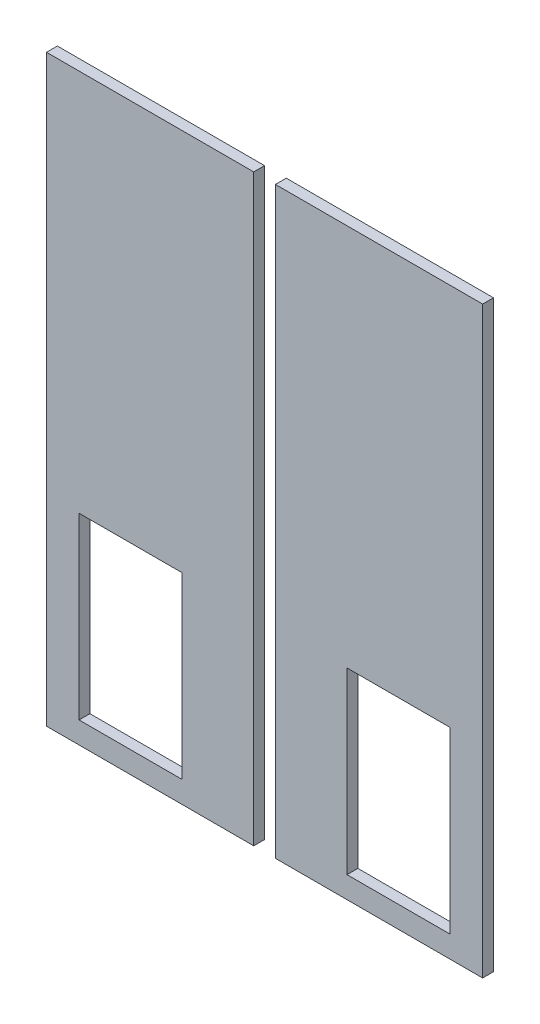
ISO-10303-21;
HEADER;
FILE_DESCRIPTION(('STEP AP214'),'2;1');
FILE_NAME('part.step','',(''),(''),'','','');
FILE_SCHEMA(('AUTOMOTIVE_DESIGN { 1 0 10303 214 1 1 1 1 }'));
ENDSEC;
DATA;
#1=APPLICATION_CONTEXT('core data for automotive mechanical design processes');
#2=APPLICATION_PROTOCOL_DEFINITION('international standard','automotive_design',2000,#1);
#3=PRODUCT_CONTEXT('',#1,'mechanical');
#4=PRODUCT('Part','Part','',(#3));
#5=PRODUCT_RELATED_PRODUCT_CATEGORY('part','',(#4));
#6=PRODUCT_DEFINITION_FORMATION('','',#4);
#7=PRODUCT_DEFINITION_CONTEXT('part definition',#1,'design');
#8=PRODUCT_DEFINITION('design','',#6,#7);
#9=PRODUCT_DEFINITION_SHAPE('','',#8);
#10=(LENGTH_UNIT() NAMED_UNIT(*) SI_UNIT(.MILLI.,.METRE.));
#11=(NAMED_UNIT(*) PLANE_ANGLE_UNIT() SI_UNIT($,.RADIAN.));
#12=(NAMED_UNIT(*) SI_UNIT($,.STERADIAN.) SOLID_ANGLE_UNIT());
#13=UNCERTAINTY_MEASURE_WITH_UNIT(LENGTH_MEASURE(1.E-05),#10,'distance_accuracy_value','');
#14=(GEOMETRIC_REPRESENTATION_CONTEXT(3) GLOBAL_UNCERTAINTY_ASSIGNED_CONTEXT((#13)) GLOBAL_UNIT_ASSIGNED_CONTEXT((#10,
#11,#12)) REPRESENTATION_CONTEXT('',''));
#15=CARTESIAN_POINT('',(0.,0.,0.));
#16=DIRECTION('',(0.,0.,1.));
#17=DIRECTION('',(1.,0.,0.));
#18=AXIS2_PLACEMENT_3D('',#15,#16,#17);
#19=CARTESIAN_POINT('',(0.,341.63,12.7));
#20=DIRECTION('',(0.,1.,0.));
#21=DIRECTION('',(0.,0.,1.));
#22=AXIS2_PLACEMENT_3D('',#19,#20,#21);
#23=PLANE('',#22);
#24=DIRECTION('',(1.,0.,0.));
#25=VECTOR('',#24,1.);
#26=CARTESIAN_POINT('',(0.,341.63,0.));
#27=LINE('',#26,#25);
#28=CARTESIAN_POINT('',(12.7,341.63,0.));
#29=VERTEX_POINT('',#28);
#30=CARTESIAN_POINT('',(255.27,341.63,0.));
#31=VERTEX_POINT('',#30);
#32=EDGE_CURVE('E172',#29,#31,#27,.T.);
#33=ORIENTED_EDGE('',*,*,#32,.F.);
#34=DIRECTION('',(0.,0.,-1.));
#35=VECTOR('',#34,1.);
#36=CARTESIAN_POINT('',(12.7,341.63,12.7));
#37=LINE('',#36,#35);
#38=CARTESIAN_POINT('',(12.7,341.63,12.7));
#39=VERTEX_POINT('',#38);
#40=EDGE_CURVE('E12',#39,#29,#37,.T.);
#41=ORIENTED_EDGE('',*,*,#40,.F.);
#42=DIRECTION('',(1.,0.,0.));
#43=VECTOR('',#42,1.);
#44=CARTESIAN_POINT('',(0.,341.63,12.7));
#45=LINE('',#44,#43);
#46=CARTESIAN_POINT('',(255.27,341.63,12.7));
#47=VERTEX_POINT('',#46);
#48=EDGE_CURVE('E142',#39,#47,#45,.T.);
#49=ORIENTED_EDGE('',*,*,#48,.T.);
#50=DIRECTION('',(0.,0.,-1.));
#51=VECTOR('',#50,1.);
#52=CARTESIAN_POINT('',(255.27,341.63,12.7));
#53=LINE('',#52,#51);
#54=EDGE_CURVE('E76',#47,#31,#53,.T.);
#55=ORIENTED_EDGE('',*,*,#54,.T.);
#56=EDGE_LOOP('',(#33,#41,#49,#55));
#57=FACE_BOUND('',#56,.T.);
#58=ADVANCED_FACE('F57',(#57),#23,.T.);
#59=CARTESIAN_POINT('',(12.7,0.,12.7));
#60=DIRECTION('',(1.,0.,0.));
#61=DIRECTION('',(0.,1.,0.));
#62=AXIS2_PLACEMENT_3D('',#59,#60,#61);
#63=PLANE('',#62);
#64=DIRECTION('',(0.,-1.,0.));
#65=VECTOR('',#64,1.);
#66=CARTESIAN_POINT('',(12.7,0.,0.));
#67=LINE('',#66,#65);
#68=CARTESIAN_POINT('',(12.7,-341.63,0.));
#69=VERTEX_POINT('',#68);
#70=EDGE_CURVE('E147',#29,#69,#67,.T.);
#71=ORIENTED_EDGE('',*,*,#70,.T.);
#72=DIRECTION('',(0.,0.,-1.));
#73=VECTOR('',#72,1.);
#74=CARTESIAN_POINT('',(12.7,-341.63,12.7));
#75=LINE('',#74,#73);
#76=CARTESIAN_POINT('',(12.7,-341.63,12.7));
#77=VERTEX_POINT('',#76);
#78=EDGE_CURVE('E67',#77,#69,#75,.T.);
#79=ORIENTED_EDGE('',*,*,#78,.F.);
#80=DIRECTION('',(0.,-1.,0.));
#81=VECTOR('',#80,1.);
#82=CARTESIAN_POINT('',(12.7,0.,12.7));
#83=LINE('',#82,#81);
#84=EDGE_CURVE('E137',#39,#77,#83,.T.);
#85=ORIENTED_EDGE('',*,*,#84,.F.);
#86=ORIENTED_EDGE('',*,*,#40,.T.);
#87=EDGE_LOOP('',(#71,#79,#85,#86));
#88=FACE_BOUND('',#87,.T.);
#89=ADVANCED_FACE('F145',(#88),#63,.F.);
#90=CARTESIAN_POINT('',(0.,-341.63,12.7));
#91=DIRECTION('',(0.,1.,0.));
#92=DIRECTION('',(0.,0.,1.));
#93=AXIS2_PLACEMENT_3D('',#90,#91,#92);
#94=PLANE('',#93);
#95=DIRECTION('',(1.,0.,0.));
#96=VECTOR('',#95,1.);
#97=CARTESIAN_POINT('',(0.,-341.63,0.));
#98=LINE('',#97,#96);
#99=CARTESIAN_POINT('',(255.27,-341.63,0.));
#100=VERTEX_POINT('',#99);
#101=EDGE_CURVE('E169',#69,#100,#98,.T.);
#102=ORIENTED_EDGE('',*,*,#101,.T.);
#103=DIRECTION('',(0.,0.,-1.));
#104=VECTOR('',#103,1.);
#105=CARTESIAN_POINT('',(255.27,-341.63,12.7));
#106=LINE('',#105,#104);
#107=CARTESIAN_POINT('',(255.27,-341.63,12.7));
#108=VERTEX_POINT('',#107);
#109=EDGE_CURVE('E102',#108,#100,#106,.T.);
#110=ORIENTED_EDGE('',*,*,#109,.F.);
#111=DIRECTION('',(1.,0.,0.));
#112=VECTOR('',#111,1.);
#113=CARTESIAN_POINT('',(0.,-341.63,12.7));
#114=LINE('',#113,#112);
#115=EDGE_CURVE('E129',#77,#108,#114,.T.);
#116=ORIENTED_EDGE('',*,*,#115,.F.);
#117=ORIENTED_EDGE('',*,*,#78,.T.);
#118=EDGE_LOOP('',(#102,#110,#116,#117));
#119=FACE_BOUND('',#118,.T.);
#120=ADVANCED_FACE('F131',(#119),#94,.F.);
#121=CARTESIAN_POINT('',(0.,-106.68,12.7));
#122=DIRECTION('',(0.,-1.,0.));
#123=DIRECTION('',(1.,0.,0.));
#124=AXIS2_PLACEMENT_3D('',#121,#122,#123);
#125=PLANE('',#124);
#126=DIRECTION('',(-1.,0.,0.));
#127=VECTOR('',#126,1.);
#128=CARTESIAN_POINT('',(0.,-106.68,0.));
#129=LINE('',#128,#127);
#130=CARTESIAN_POINT('',(217.17,-106.68,0.));
#131=VERTEX_POINT('',#130);
#132=CARTESIAN_POINT('',(96.52,-106.68,0.));
#133=VERTEX_POINT('',#132);
#134=EDGE_CURVE('E181',#131,#133,#129,.T.);
#135=ORIENTED_EDGE('',*,*,#134,.F.);
#136=DIRECTION('',(0.,0.,-1.));
#137=VECTOR('',#136,1.);
#138=CARTESIAN_POINT('',(217.17,-106.68,12.7));
#139=LINE('',#138,#137);
#140=CARTESIAN_POINT('',(217.17,-106.68,12.7));
#141=VERTEX_POINT('',#140);
#142=EDGE_CURVE('E61',#141,#131,#139,.T.);
#143=ORIENTED_EDGE('',*,*,#142,.F.);
#144=DIRECTION('',(-1.,0.,0.));
#145=VECTOR('',#144,1.);
#146=CARTESIAN_POINT('',(0.,-106.68,12.7));
#147=LINE('',#146,#145);
#148=CARTESIAN_POINT('',(96.52,-106.68,12.7));
#149=VERTEX_POINT('',#148);
#150=EDGE_CURVE('E168',#141,#149,#147,.T.);
#151=ORIENTED_EDGE('',*,*,#150,.T.);
#152=DIRECTION('',(0.,0.,-1.));
#153=VECTOR('',#152,1.);
#154=CARTESIAN_POINT('',(96.52,-106.68,12.7));
#155=LINE('',#154,#153);
#156=EDGE_CURVE('E152',#149,#133,#155,.T.);
#157=ORIENTED_EDGE('',*,*,#156,.T.);
#158=EDGE_LOOP('',(#135,#143,#151,#157));
#159=FACE_BOUND('',#158,.T.);
#160=ADVANCED_FACE('F59',(#159),#125,.T.);
#161=CARTESIAN_POINT('',(217.17,1.72589215646274E-13,12.7));
#162=DIRECTION('',(1.,0.,0.));
#163=DIRECTION('',(0.,1.,0.));
#164=AXIS2_PLACEMENT_3D('',#161,#162,#163);
#165=PLANE('',#164);
#166=DIRECTION('',(0.,-1.,0.));
#167=VECTOR('',#166,1.);
#168=CARTESIAN_POINT('',(217.17,1.72589215646274E-13,0.));
#169=LINE('',#168,#167);
#170=CARTESIAN_POINT('',(217.17,-316.23,0.));
#171=VERTEX_POINT('',#170);
#172=EDGE_CURVE('E179',#131,#171,#169,.T.);
#173=ORIENTED_EDGE('',*,*,#172,.T.);
#174=DIRECTION('',(0.,0.,-1.));
#175=VECTOR('',#174,1.);
#176=CARTESIAN_POINT('',(217.17,-316.23,12.7));
#177=LINE('',#176,#175);
#178=CARTESIAN_POINT('',(217.17,-316.23,12.7));
#179=VERTEX_POINT('',#178);
#180=EDGE_CURVE('E156',#179,#171,#177,.T.);
#181=ORIENTED_EDGE('',*,*,#180,.F.);
#182=DIRECTION('',(0.,-1.,0.));
#183=VECTOR('',#182,1.);
#184=CARTESIAN_POINT('',(217.17,1.72589215646274E-13,12.7));
#185=LINE('',#184,#183);
#186=EDGE_CURVE('E190',#141,#179,#185,.T.);
#187=ORIENTED_EDGE('',*,*,#186,.F.);
#188=ORIENTED_EDGE('',*,*,#142,.T.);
#189=EDGE_LOOP('',(#173,#181,#187,#188));
#190=FACE_BOUND('',#189,.T.);
#191=ADVANCED_FACE('F203',(#190),#165,.F.);
#192=CARTESIAN_POINT('',(-1.45497649016665E-13,-316.23,12.7));
#193=DIRECTION('',(0.,-1.,0.));
#194=DIRECTION('',(1.,0.,0.));
#195=AXIS2_PLACEMENT_3D('',#192,#193,#194);
#196=PLANE('',#195);
#197=DIRECTION('',(-1.,0.,0.));
#198=VECTOR('',#197,1.);
#199=CARTESIAN_POINT('',(-1.45497649016665E-13,-316.23,0.));
#200=LINE('',#199,#198);
#201=CARTESIAN_POINT('',(96.5200000000001,-316.23,0.));
#202=VERTEX_POINT('',#201);
#203=EDGE_CURVE('E177',#171,#202,#200,.T.);
#204=ORIENTED_EDGE('',*,*,#203,.T.);
#205=DIRECTION('',(0.,0.,-1.));
#206=VECTOR('',#205,1.);
#207=CARTESIAN_POINT('',(96.5200000000001,-316.23,12.7));
#208=LINE('',#207,#206);
#209=CARTESIAN_POINT('',(96.5200000000001,-316.23,12.7));
#210=VERTEX_POINT('',#209);
#211=EDGE_CURVE('E154',#210,#202,#208,.T.);
#212=ORIENTED_EDGE('',*,*,#211,.F.);
#213=DIRECTION('',(-1.,0.,0.));
#214=VECTOR('',#213,1.);
#215=CARTESIAN_POINT('',(-1.45497649016665E-13,-316.23,12.7));
#216=LINE('',#215,#214);
#217=EDGE_CURVE('E188',#179,#210,#216,.T.);
#218=ORIENTED_EDGE('',*,*,#217,.F.);
#219=ORIENTED_EDGE('',*,*,#180,.T.);
#220=EDGE_LOOP('',(#204,#212,#218,#219));
#221=FACE_BOUND('',#220,.T.);
#222=ADVANCED_FACE('F204',(#221),#196,.F.);
#223=CARTESIAN_POINT('',(96.52,0.,12.7));
#224=DIRECTION('',(-1.,0.,0.));
#225=DIRECTION('',(0.,-1.,0.));
#226=AXIS2_PLACEMENT_3D('',#223,#224,#225);
#227=PLANE('',#226);
#228=DIRECTION('',(0.,1.,0.));
#229=VECTOR('',#228,1.);
#230=CARTESIAN_POINT('',(96.52,0.,0.));
#231=LINE('',#230,#229);
#232=EDGE_CURVE('E174',#202,#133,#231,.T.);
#233=ORIENTED_EDGE('',*,*,#232,.T.);
#234=ORIENTED_EDGE('',*,*,#156,.F.);
#235=DIRECTION('',(0.,1.,0.));
#236=VECTOR('',#235,1.);
#237=CARTESIAN_POINT('',(96.52,0.,12.7));
#238=LINE('',#237,#236);
#239=EDGE_CURVE('E186',#210,#149,#238,.T.);
#240=ORIENTED_EDGE('',*,*,#239,.F.);
#241=ORIENTED_EDGE('',*,*,#211,.T.);
#242=EDGE_LOOP('',(#233,#234,#240,#241));
#243=FACE_BOUND('',#242,.T.);
#244=ADVANCED_FACE('F198',(#243),#227,.F.);
#245=CARTESIAN_POINT('',(255.27,0.,12.7));
#246=DIRECTION('',(1.,0.,0.));
#247=DIRECTION('',(0.,1.,0.));
#248=AXIS2_PLACEMENT_3D('',#245,#246,#247);
#249=PLANE('',#248);
#250=DIRECTION('',(0.,-1.,0.));
#251=VECTOR('',#250,1.);
#252=CARTESIAN_POINT('',(255.27,0.,0.));
#253=LINE('',#252,#251);
#254=EDGE_CURVE('E165',#31,#100,#253,.T.);
#255=ORIENTED_EDGE('',*,*,#254,.F.);
#256=ORIENTED_EDGE('',*,*,#54,.F.);
#257=DIRECTION('',(0.,-1.,0.));
#258=VECTOR('',#257,1.);
#259=CARTESIAN_POINT('',(255.27,0.,12.7));
#260=LINE('',#259,#258);
#261=EDGE_CURVE('E136',#47,#108,#260,.T.);
#262=ORIENTED_EDGE('',*,*,#261,.T.);
#263=ORIENTED_EDGE('',*,*,#109,.T.);
#264=EDGE_LOOP('',(#255,#256,#262,#263));
#265=FACE_BOUND('',#264,.T.);
#266=ADVANCED_FACE('F211',(#265),#249,.T.);
#267=CARTESIAN_POINT('',(0.,0.,12.7));
#268=DIRECTION('',(0.,0.,1.));
#269=DIRECTION('',(1.,0.,0.));
#270=AXIS2_PLACEMENT_3D('',#267,#268,#269);
#271=PLANE('',#270);
#272=ORIENTED_EDGE('',*,*,#150,.F.);
#273=ORIENTED_EDGE('',*,*,#186,.T.);
#274=ORIENTED_EDGE('',*,*,#217,.T.);
#275=ORIENTED_EDGE('',*,*,#239,.T.);
#276=EDGE_LOOP('',(#272,#273,#274,#275));
#277=FACE_BOUND('',#276,.T.);
#278=ORIENTED_EDGE('',*,*,#48,.F.);
#279=ORIENTED_EDGE('',*,*,#84,.T.);
#280=ORIENTED_EDGE('',*,*,#115,.T.);
#281=ORIENTED_EDGE('',*,*,#261,.F.);
#282=EDGE_LOOP('',(#278,#279,#280,#281));
#283=FACE_BOUND('',#282,.T.);
#284=ADVANCED_FACE('F141',(#277,#283),#271,.T.);
#285=CARTESIAN_POINT('',(0.,0.,0.));
#286=DIRECTION('',(0.,0.,1.));
#287=DIRECTION('',(1.,0.,0.));
#288=AXIS2_PLACEMENT_3D('',#285,#286,#287);
#289=PLANE('',#288);
#290=ORIENTED_EDGE('',*,*,#134,.T.);
#291=ORIENTED_EDGE('',*,*,#232,.F.);
#292=ORIENTED_EDGE('',*,*,#203,.F.);
#293=ORIENTED_EDGE('',*,*,#172,.F.);
#294=EDGE_LOOP('',(#290,#291,#292,#293));
#295=FACE_BOUND('',#294,.T.);
#296=ORIENTED_EDGE('',*,*,#32,.T.);
#297=ORIENTED_EDGE('',*,*,#254,.T.);
#298=ORIENTED_EDGE('',*,*,#101,.F.);
#299=ORIENTED_EDGE('',*,*,#70,.F.);
#300=EDGE_LOOP('',(#296,#297,#298,#299));
#301=FACE_BOUND('',#300,.T.);
#302=ADVANCED_FACE('F201',(#295,#301),#289,.F.);
#303=CLOSED_SHELL('',(#58,#89,#120,#160,#191,#222,#244,#266,#284,#302));
#304=MANIFOLD_SOLID_BREP('B2',#303);
#305=CARTESIAN_POINT('',(1.45497649016665E-13,-316.23,12.7));
#306=DIRECTION('',(0.,1.,0.));
#307=DIRECTION('',(-1.,0.,0.));
#308=AXIS2_PLACEMENT_3D('',#305,#306,#307);
#309=PLANE('',#308);
#310=DIRECTION('',(1.,0.,0.));
#311=VECTOR('',#310,1.);
#312=CARTESIAN_POINT('',(1.45497649016665E-13,-316.23,0.));
#313=LINE('',#312,#311);
#314=CARTESIAN_POINT('',(-217.17,-316.23,0.));
#315=VERTEX_POINT('',#314);
#316=CARTESIAN_POINT('',(-96.5199999999999,-316.23,0.));
#317=VERTEX_POINT('',#316);
#318=EDGE_CURVE('E406',#315,#317,#313,.T.);
#319=ORIENTED_EDGE('',*,*,#318,.F.);
#320=DIRECTION('',(0.,0.,-1.));
#321=VECTOR('',#320,1.);
#322=CARTESIAN_POINT('',(-217.17,-316.23,12.7));
#323=LINE('',#322,#321);
#324=CARTESIAN_POINT('',(-217.17,-316.23,12.7));
#325=VERTEX_POINT('',#324);
#326=EDGE_CURVE('E55',#325,#315,#323,.T.);
#327=ORIENTED_EDGE('',*,*,#326,.F.);
#328=DIRECTION('',(1.,0.,0.));
#329=VECTOR('',#328,1.);
#330=CARTESIAN_POINT('',(1.45497649016665E-13,-316.23,12.7));
#331=LINE('',#330,#329);
#332=CARTESIAN_POINT('',(-96.5199999999999,-316.23,12.7));
#333=VERTEX_POINT('',#332);
#334=EDGE_CURVE('E380',#325,#333,#331,.T.);
#335=ORIENTED_EDGE('',*,*,#334,.T.);
#336=DIRECTION('',(0.,0.,-1.));
#337=VECTOR('',#336,1.);
#338=CARTESIAN_POINT('',(-96.5199999999999,-316.23,12.7));
#339=LINE('',#338,#337);
#340=EDGE_CURVE('E307',#333,#317,#339,.T.);
#341=ORIENTED_EDGE('',*,*,#340,.T.);
#342=EDGE_LOOP('',(#319,#327,#335,#341));
#343=FACE_BOUND('',#342,.T.);
#344=ADVANCED_FACE('F287',(#343),#309,.T.);
#345=CARTESIAN_POINT('',(-217.17,1.15059477097516E-13,12.7));
#346=DIRECTION('',(1.,0.,0.));
#347=DIRECTION('',(0.,1.,0.));
#348=AXIS2_PLACEMENT_3D('',#345,#346,#347);
#349=PLANE('',#348);
#350=DIRECTION('',(0.,-1.,0.));
#351=VECTOR('',#350,1.);
#352=CARTESIAN_POINT('',(-217.17,1.15059477097516E-13,0.));
#353=LINE('',#352,#351);
#354=CARTESIAN_POINT('',(-217.17,-106.68,0.));
#355=VERTEX_POINT('',#354);
#356=EDGE_CURVE('E366',#355,#315,#353,.T.);
#357=ORIENTED_EDGE('',*,*,#356,.F.);
#358=DIRECTION('',(0.,0.,-1.));
#359=VECTOR('',#358,1.);
#360=CARTESIAN_POINT('',(-217.17,-106.68,12.7));
#361=LINE('',#360,#359);
#362=CARTESIAN_POINT('',(-217.17,-106.68,12.7));
#363=VERTEX_POINT('',#362);
#364=EDGE_CURVE('E298',#363,#355,#361,.T.);
#365=ORIENTED_EDGE('',*,*,#364,.F.);
#366=DIRECTION('',(0.,-1.,0.));
#367=VECTOR('',#366,1.);
#368=CARTESIAN_POINT('',(-217.17,1.15059477097516E-13,12.7));
#369=LINE('',#368,#367);
#370=EDGE_CURVE('E364',#363,#325,#369,.T.);
#371=ORIENTED_EDGE('',*,*,#370,.T.);
#372=ORIENTED_EDGE('',*,*,#326,.T.);
#373=EDGE_LOOP('',(#357,#365,#371,#372));
#374=FACE_BOUND('',#373,.T.);
#375=ADVANCED_FACE('F362',(#374),#349,.T.);
#376=CARTESIAN_POINT('',(0.,-106.68,12.7));
#377=DIRECTION('',(0.,1.,0.));
#378=DIRECTION('',(0.,0.,1.));
#379=AXIS2_PLACEMENT_3D('',#376,#377,#378);
#380=PLANE('',#379);
#381=DIRECTION('',(1.,0.,0.));
#382=VECTOR('',#381,1.);
#383=CARTESIAN_POINT('',(0.,-106.68,0.));
#384=LINE('',#383,#382);
#385=CARTESIAN_POINT('',(-96.5199999999999,-106.68,0.));
#386=VERTEX_POINT('',#385);
#387=EDGE_CURVE('E411',#355,#386,#384,.T.);
#388=ORIENTED_EDGE('',*,*,#387,.T.);
#389=DIRECTION('',(0.,0.,-1.));
#390=VECTOR('',#389,1.);
#391=CARTESIAN_POINT('',(-96.5199999999999,-106.68,12.7));
#392=LINE('',#391,#390);
#393=CARTESIAN_POINT('',(-96.5199999999999,-106.68,12.7));
#394=VERTEX_POINT('',#393);
#395=EDGE_CURVE('E333',#394,#386,#392,.T.);
#396=ORIENTED_EDGE('',*,*,#395,.F.);
#397=DIRECTION('',(1.,0.,0.));
#398=VECTOR('',#397,1.);
#399=CARTESIAN_POINT('',(0.,-106.68,12.7));
#400=LINE('',#399,#398);
#401=EDGE_CURVE('E371',#363,#394,#400,.T.);
#402=ORIENTED_EDGE('',*,*,#401,.F.);
#403=ORIENTED_EDGE('',*,*,#364,.T.);
#404=EDGE_LOOP('',(#388,#396,#402,#403));
#405=FACE_BOUND('',#404,.T.);
#406=ADVANCED_FACE('F372',(#405),#380,.F.);
#407=CARTESIAN_POINT('',(-12.7,0.,12.7));
#408=DIRECTION('',(1.,0.,0.));
#409=DIRECTION('',(0.,1.,0.));
#410=AXIS2_PLACEMENT_3D('',#407,#408,#409);
#411=PLANE('',#410);
#412=DIRECTION('',(0.,-1.,0.));
#413=VECTOR('',#412,1.);
#414=CARTESIAN_POINT('',(-12.7,0.,0.));
#415=LINE('',#414,#413);
#416=CARTESIAN_POINT('',(-12.7,341.63,0.));
#417=VERTEX_POINT('',#416);
#418=CARTESIAN_POINT('',(-12.7,-341.63,0.));
#419=VERTEX_POINT('',#418);
#420=EDGE_CURVE('E391',#417,#419,#415,.T.);
#421=ORIENTED_EDGE('',*,*,#420,.F.);
#422=DIRECTION('',(0.,0.,-1.));
#423=VECTOR('',#422,1.);
#424=CARTESIAN_POINT('',(-12.7,341.63,12.7));
#425=LINE('',#424,#423);
#426=CARTESIAN_POINT('',(-12.7,341.63,12.7));
#427=VERTEX_POINT('',#426);
#428=EDGE_CURVE('E291',#427,#417,#425,.T.);
#429=ORIENTED_EDGE('',*,*,#428,.F.);
#430=DIRECTION('',(0.,-1.,0.));
#431=VECTOR('',#430,1.);
#432=CARTESIAN_POINT('',(-12.7,0.,12.7));
#433=LINE('',#432,#431);
#434=CARTESIAN_POINT('',(-12.7,-341.63,12.7));
#435=VERTEX_POINT('',#434);
#436=EDGE_CURVE('E418',#427,#435,#433,.T.);
#437=ORIENTED_EDGE('',*,*,#436,.T.);
#438=DIRECTION('',(0.,0.,-1.));
#439=VECTOR('',#438,1.);
#440=CARTESIAN_POINT('',(-12.7,-341.63,12.7));
#441=LINE('',#440,#439);
#442=EDGE_CURVE('E390',#435,#419,#441,.T.);
#443=ORIENTED_EDGE('',*,*,#442,.T.);
#444=EDGE_LOOP('',(#421,#429,#437,#443));
#445=FACE_BOUND('',#444,.T.);
#446=ADVANCED_FACE('F289',(#445),#411,.T.);
#447=CARTESIAN_POINT('',(0.,341.63,12.7));
#448=DIRECTION('',(0.,1.,0.));
#449=DIRECTION('',(0.,0.,1.));
#450=AXIS2_PLACEMENT_3D('',#447,#448,#449);
#451=PLANE('',#450);
#452=DIRECTION('',(1.,0.,0.));
#453=VECTOR('',#452,1.);
#454=CARTESIAN_POINT('',(0.,341.63,0.));
#455=LINE('',#454,#453);
#456=CARTESIAN_POINT('',(-255.27,341.63,0.));
#457=VERTEX_POINT('',#456);
#458=EDGE_CURVE('E395',#457,#417,#455,.T.);
#459=ORIENTED_EDGE('',*,*,#458,.F.);
#460=DIRECTION('',(0.,0.,-1.));
#461=VECTOR('',#460,1.);
#462=CARTESIAN_POINT('',(-255.27,341.63,12.7));
#463=LINE('',#462,#461);
#464=CARTESIAN_POINT('',(-255.27,341.63,12.7));
#465=VERTEX_POINT('',#464);
#466=EDGE_CURVE('E428',#465,#457,#463,.T.);
#467=ORIENTED_EDGE('',*,*,#466,.F.);
#468=DIRECTION('',(1.,0.,0.));
#469=VECTOR('',#468,1.);
#470=CARTESIAN_POINT('',(0.,341.63,12.7));
#471=LINE('',#470,#469);
#472=EDGE_CURVE('E439',#465,#427,#471,.T.);
#473=ORIENTED_EDGE('',*,*,#472,.T.);
#474=ORIENTED_EDGE('',*,*,#428,.T.);
#475=EDGE_LOOP('',(#459,#467,#473,#474));
#476=FACE_BOUND('',#475,.T.);
#477=ADVANCED_FACE('F437',(#476),#451,.T.);
#478=CARTESIAN_POINT('',(-255.27,0.,12.7));
#479=DIRECTION('',(1.,0.,0.));
#480=DIRECTION('',(0.,1.,0.));
#481=AXIS2_PLACEMENT_3D('',#478,#479,#480);
#482=PLANE('',#481);
#483=DIRECTION('',(0.,-1.,0.));
#484=VECTOR('',#483,1.);
#485=CARTESIAN_POINT('',(-255.27,0.,0.));
#486=LINE('',#485,#484);
#487=CARTESIAN_POINT('',(-255.27,-341.63,0.));
#488=VERTEX_POINT('',#487);
#489=EDGE_CURVE('E399',#457,#488,#486,.T.);
#490=ORIENTED_EDGE('',*,*,#489,.T.);
#491=DIRECTION('',(0.,0.,-1.));
#492=VECTOR('',#491,1.);
#493=CARTESIAN_POINT('',(-255.27,-341.63,12.7));
#494=LINE('',#493,#492);
#495=CARTESIAN_POINT('',(-255.27,-341.63,12.7));
#496=VERTEX_POINT('',#495);
#497=EDGE_CURVE('E425',#496,#488,#494,.T.);
#498=ORIENTED_EDGE('',*,*,#497,.F.);
#499=DIRECTION('',(0.,-1.,0.));
#500=VECTOR('',#499,1.);
#501=CARTESIAN_POINT('',(-255.27,0.,12.7));
#502=LINE('',#501,#500);
#503=EDGE_CURVE('E452',#465,#496,#502,.T.);
#504=ORIENTED_EDGE('',*,*,#503,.F.);
#505=ORIENTED_EDGE('',*,*,#466,.T.);
#506=EDGE_LOOP('',(#490,#498,#504,#505));
#507=FACE_BOUND('',#506,.T.);
#508=ADVANCED_FACE('F446',(#507),#482,.F.);
#509=CARTESIAN_POINT('',(0.,-341.63,12.7));
#510=DIRECTION('',(0.,1.,0.));
#511=DIRECTION('',(0.,0.,1.));
#512=AXIS2_PLACEMENT_3D('',#509,#510,#511);
#513=PLANE('',#512);
#514=DIRECTION('',(1.,0.,0.));
#515=VECTOR('',#514,1.);
#516=CARTESIAN_POINT('',(0.,-341.63,0.));
#517=LINE('',#516,#515);
#518=EDGE_CURVE('E402',#488,#419,#517,.T.);
#519=ORIENTED_EDGE('',*,*,#518,.T.);
#520=ORIENTED_EDGE('',*,*,#442,.F.);
#521=DIRECTION('',(1.,0.,0.));
#522=VECTOR('',#521,1.);
#523=CARTESIAN_POINT('',(0.,-341.63,12.7));
#524=LINE('',#523,#522);
#525=EDGE_CURVE('E384',#496,#435,#524,.T.);
#526=ORIENTED_EDGE('',*,*,#525,.F.);
#527=ORIENTED_EDGE('',*,*,#497,.T.);
#528=EDGE_LOOP('',(#519,#520,#526,#527));
#529=FACE_BOUND('',#528,.T.);
#530=ADVANCED_FACE('F449',(#529),#513,.F.);
#531=CARTESIAN_POINT('',(-96.5199999999999,0.,12.7));
#532=DIRECTION('',(-1.,0.,0.));
#533=DIRECTION('',(0.,0.,1.));
#534=AXIS2_PLACEMENT_3D('',#531,#532,#533);
#535=PLANE('',#534);
#536=DIRECTION('',(0.,1.,0.));
#537=VECTOR('',#536,1.);
#538=CARTESIAN_POINT('',(-96.5199999999999,0.,0.));
#539=LINE('',#538,#537);
#540=EDGE_CURVE('E414',#317,#386,#539,.T.);
#541=ORIENTED_EDGE('',*,*,#540,.F.);
#542=ORIENTED_EDGE('',*,*,#340,.F.);
#543=DIRECTION('',(0.,1.,0.));
#544=VECTOR('',#543,1.);
#545=CARTESIAN_POINT('',(-96.5199999999999,0.,12.7));
#546=LINE('',#545,#544);
#547=EDGE_CURVE('E376',#333,#394,#546,.T.);
#548=ORIENTED_EDGE('',*,*,#547,.T.);
#549=ORIENTED_EDGE('',*,*,#395,.T.);
#550=EDGE_LOOP('',(#541,#542,#548,#549));
#551=FACE_BOUND('',#550,.T.);
#552=ADVANCED_FACE('F460',(#551),#535,.T.);
#553=CARTESIAN_POINT('',(0.,0.,12.7));
#554=DIRECTION('',(0.,0.,1.));
#555=DIRECTION('',(1.,0.,0.));
#556=AXIS2_PLACEMENT_3D('',#553,#554,#555);
#557=PLANE('',#556);
#558=ORIENTED_EDGE('',*,*,#436,.F.);
#559=ORIENTED_EDGE('',*,*,#472,.F.);
#560=ORIENTED_EDGE('',*,*,#503,.T.);
#561=ORIENTED_EDGE('',*,*,#525,.T.);
#562=EDGE_LOOP('',(#558,#559,#560,#561));
#563=FACE_BOUND('',#562,.T.);
#564=ORIENTED_EDGE('',*,*,#334,.F.);
#565=ORIENTED_EDGE('',*,*,#370,.F.);
#566=ORIENTED_EDGE('',*,*,#401,.T.);
#567=ORIENTED_EDGE('',*,*,#547,.F.);
#568=EDGE_LOOP('',(#564,#565,#566,#567));
#569=FACE_BOUND('',#568,.T.);
#570=ADVANCED_FACE('F379',(#563,#569),#557,.T.);
#571=CARTESIAN_POINT('',(0.,0.,0.));
#572=DIRECTION('',(0.,0.,1.));
#573=DIRECTION('',(1.,0.,0.));
#574=AXIS2_PLACEMENT_3D('',#571,#572,#573);
#575=PLANE('',#574);
#576=ORIENTED_EDGE('',*,*,#420,.T.);
#577=ORIENTED_EDGE('',*,*,#518,.F.);
#578=ORIENTED_EDGE('',*,*,#489,.F.);
#579=ORIENTED_EDGE('',*,*,#458,.T.);
#580=EDGE_LOOP('',(#576,#577,#578,#579));
#581=FACE_BOUND('',#580,.T.);
#582=ORIENTED_EDGE('',*,*,#318,.T.);
#583=ORIENTED_EDGE('',*,*,#540,.T.);
#584=ORIENTED_EDGE('',*,*,#387,.F.);
#585=ORIENTED_EDGE('',*,*,#356,.T.);
#586=EDGE_LOOP('',(#582,#583,#584,#585));
#587=FACE_BOUND('',#586,.T.);
#588=ADVANCED_FACE('F443',(#581,#587),#575,.F.);
#589=CLOSED_SHELL('',(#344,#375,#406,#446,#477,#508,#530,#552,#570,#588));
#590=MANIFOLD_SOLID_BREP('B6',#589);
#591=ADVANCED_BREP_SHAPE_REPRESENTATION('',(#18,#304,#590),#14);
#592=SHAPE_DEFINITION_REPRESENTATION(#9,#591);
ENDSEC;
END-ISO-10303-21;
